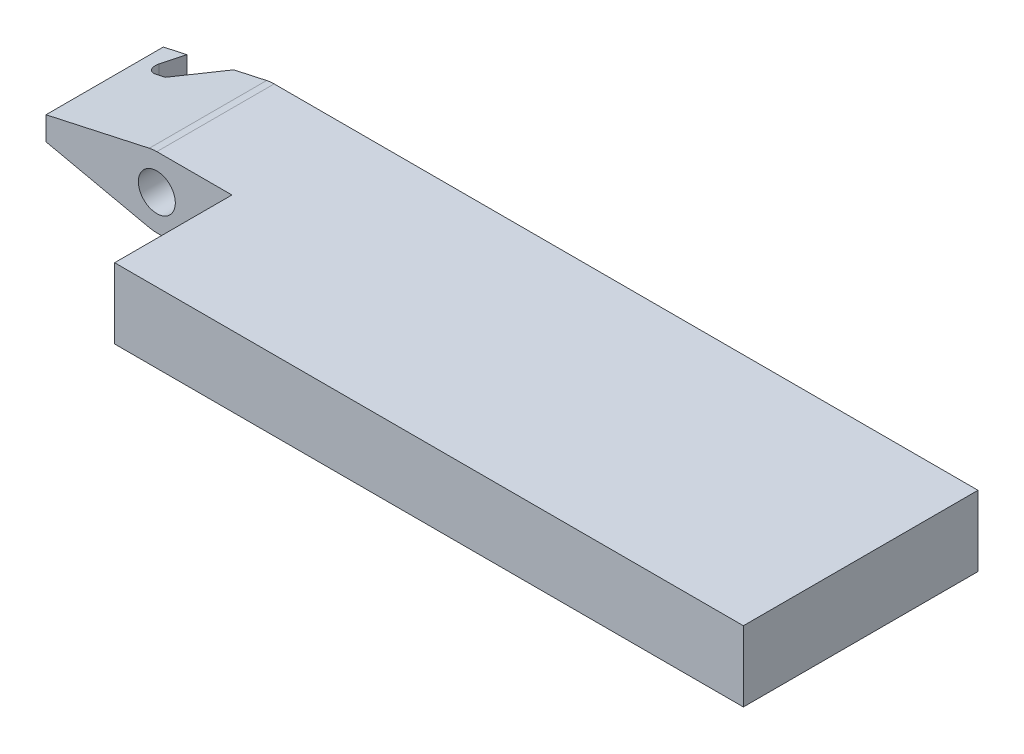
ISO-10303-21;
HEADER;
FILE_DESCRIPTION(('STEP AP214'),'2;1');
FILE_NAME('part.step','',(''),(''),'','','');
FILE_SCHEMA(('AUTOMOTIVE_DESIGN { 1 0 10303 214 1 1 1 1 }'));
ENDSEC;
DATA;
#1=APPLICATION_CONTEXT('core data for automotive mechanical design processes');
#2=APPLICATION_PROTOCOL_DEFINITION('international standard','automotive_design',2000,#1);
#3=PRODUCT_CONTEXT('',#1,'mechanical');
#4=PRODUCT('Part','Part','',(#3));
#5=PRODUCT_RELATED_PRODUCT_CATEGORY('part','',(#4));
#6=PRODUCT_DEFINITION_FORMATION('','',#4);
#7=PRODUCT_DEFINITION_CONTEXT('part definition',#1,'design');
#8=PRODUCT_DEFINITION('design','',#6,#7);
#9=PRODUCT_DEFINITION_SHAPE('','',#8);
#10=(LENGTH_UNIT() NAMED_UNIT(*) SI_UNIT(.MILLI.,.METRE.));
#11=(NAMED_UNIT(*) PLANE_ANGLE_UNIT() SI_UNIT($,.RADIAN.));
#12=(NAMED_UNIT(*) SI_UNIT($,.STERADIAN.) SOLID_ANGLE_UNIT());
#13=UNCERTAINTY_MEASURE_WITH_UNIT(LENGTH_MEASURE(1.E-05),#10,'distance_accuracy_value','');
#14=(GEOMETRIC_REPRESENTATION_CONTEXT(3) GLOBAL_UNCERTAINTY_ASSIGNED_CONTEXT((#13)) GLOBAL_UNIT_ASSIGNED_CONTEXT((#10,
#11,#12)) REPRESENTATION_CONTEXT('',''));
#15=CARTESIAN_POINT('',(0.,0.,0.));
#16=DIRECTION('',(0.,0.,1.));
#17=DIRECTION('',(1.,0.,0.));
#18=AXIS2_PLACEMENT_3D('',#15,#16,#17);
#19=CARTESIAN_POINT('',(0.,3.81,-12.7));
#20=DIRECTION('',(0.,0.,1.));
#21=DIRECTION('',(1.,0.,0.));
#22=AXIS2_PLACEMENT_3D('',#19,#20,#21);
#23=PLANE('',#22);
#24=DIRECTION('',(0.976807089673857,0.214121249676183,0.));
#25=VECTOR('',#24,1.);
#26=CARTESIAN_POINT('',(-0.407900980633129,3.7658175058287,-12.7));
#27=LINE('',#26,#25);
#28=CARTESIAN_POINT('',(-6.,2.54,-12.7));
#29=VERTEX_POINT('',#28);
#30=CARTESIAN_POINT('',(-4.73,2.81839067709833,-12.7));
#31=VERTEX_POINT('',#30);
#32=EDGE_CURVE('E177',#29,#31,#27,.T.);
#33=ORIENTED_EDGE('',*,*,#32,.T.);
#34=DIRECTION('',(0.,-1.,0.));
#35=VECTOR('',#34,1.);
#36=CARTESIAN_POINT('',(-4.73,3.81,-12.7));
#37=LINE('',#36,#35);
#38=CARTESIAN_POINT('',(-4.73,0.991609322901672,-12.7));
#39=VERTEX_POINT('',#38);
#40=EDGE_CURVE('E306',#31,#39,#37,.T.);
#41=ORIENTED_EDGE('',*,*,#40,.T.);
#42=DIRECTION('',(-0.976807089673857,0.214121249676183,0.));
#43=VECTOR('',#42,1.);
#44=CARTESIAN_POINT('',(-6.,1.27,-12.7));
#45=LINE('',#44,#43);
#46=CARTESIAN_POINT('',(-6.,1.27,-12.7));
#47=VERTEX_POINT('',#46);
#48=EDGE_CURVE('E297',#39,#47,#45,.T.);
#49=ORIENTED_EDGE('',*,*,#48,.T.);
#50=DIRECTION('',(0.,1.,0.));
#51=VECTOR('',#50,1.);
#52=CARTESIAN_POINT('',(-6.,2.54,-12.7));
#53=LINE('',#52,#51);
#54=EDGE_CURVE('E178',#47,#29,#53,.T.);
#55=ORIENTED_EDGE('',*,*,#54,.T.);
#56=EDGE_LOOP('',(#33,#41,#49,#55));
#57=FACE_BOUND('',#56,.T.);
#58=ADVANCED_FACE('F39',(#57),#23,.F.);
#59=CARTESIAN_POINT('',(0.,3.81,0.));
#60=DIRECTION('',(0.,0.,-1.));
#61=DIRECTION('',(-1.,0.,0.));
#62=AXIS2_PLACEMENT_3D('',#59,#60,#61);
#63=PLANE('',#62);
#64=DIRECTION('',(1.,0.,0.));
#65=VECTOR('',#64,1.);
#66=CARTESIAN_POINT('',(0.,3.81,0.));
#67=LINE('',#66,#65);
#68=CARTESIAN_POINT('',(4.064,3.81,0.));
#69=VERTEX_POINT('',#68);
#70=CARTESIAN_POINT('',(38.1,3.81,0.));
#71=VERTEX_POINT('',#70);
#72=EDGE_CURVE('E232',#69,#71,#67,.T.);
#73=ORIENTED_EDGE('',*,*,#72,.F.);
#74=DIRECTION('',(0.,1.,0.));
#75=VECTOR('',#74,1.);
#76=CARTESIAN_POINT('',(4.064,0.,0.));
#77=LINE('',#76,#75);
#78=CARTESIAN_POINT('',(4.064,0.,0.));
#79=VERTEX_POINT('',#78);
#80=EDGE_CURVE('E215',#79,#69,#77,.T.);
#81=ORIENTED_EDGE('',*,*,#80,.F.);
#82=DIRECTION('',(1.,0.,0.));
#83=VECTOR('',#82,1.);
#84=CARTESIAN_POINT('',(0.,0.,0.));
#85=LINE('',#84,#83);
#86=CARTESIAN_POINT('',(38.1,0.,0.));
#87=VERTEX_POINT('',#86);
#88=EDGE_CURVE('E247',#79,#87,#85,.T.);
#89=ORIENTED_EDGE('',*,*,#88,.T.);
#90=DIRECTION('',(0.,-1.,0.));
#91=VECTOR('',#90,1.);
#92=CARTESIAN_POINT('',(38.1,3.81,0.));
#93=LINE('',#92,#91);
#94=EDGE_CURVE('E258',#71,#87,#93,.T.);
#95=ORIENTED_EDGE('',*,*,#94,.F.);
#96=EDGE_LOOP('',(#73,#81,#89,#95));
#97=FACE_BOUND('',#96,.T.);
#98=ADVANCED_FACE('F325',(#97),#63,.F.);
#99=CARTESIAN_POINT('',(38.1,3.81,0.));
#100=DIRECTION('',(-1.,0.,0.));
#101=DIRECTION('',(0.,0.,1.));
#102=AXIS2_PLACEMENT_3D('',#99,#100,#101);
#103=PLANE('',#102);
#104=DIRECTION('',(0.,0.,-1.));
#105=VECTOR('',#104,1.);
#106=CARTESIAN_POINT('',(38.1,0.,0.));
#107=LINE('',#106,#105);
#108=CARTESIAN_POINT('',(38.1,0.,-12.7));
#109=VERTEX_POINT('',#108);
#110=EDGE_CURVE('E250',#87,#109,#107,.T.);
#111=ORIENTED_EDGE('',*,*,#110,.T.);
#112=DIRECTION('',(0.,-1.,0.));
#113=VECTOR('',#112,1.);
#114=CARTESIAN_POINT('',(38.1,3.81,-12.7));
#115=LINE('',#114,#113);
#116=CARTESIAN_POINT('',(38.1,3.81,-12.7));
#117=VERTEX_POINT('',#116);
#118=EDGE_CURVE('E243',#117,#109,#115,.T.);
#119=ORIENTED_EDGE('',*,*,#118,.F.);
#120=DIRECTION('',(0.,0.,-1.));
#121=VECTOR('',#120,1.);
#122=CARTESIAN_POINT('',(38.1,3.81,0.));
#123=LINE('',#122,#121);
#124=EDGE_CURVE('E236',#71,#117,#123,.T.);
#125=ORIENTED_EDGE('',*,*,#124,.F.);
#126=ORIENTED_EDGE('',*,*,#94,.T.);
#127=EDGE_LOOP('',(#111,#119,#125,#126));
#128=FACE_BOUND('',#127,.T.);
#129=ADVANCED_FACE('F330',(#128),#103,.F.);
#130=CARTESIAN_POINT('',(-0.407900980633129,0.0441824941713048,-12.7));
#131=VERTEX_POINT('',#130);
#132=CARTESIAN_POINT('',(-2.19,0.434827968705013,-12.7));
#133=VERTEX_POINT('',#132);
#134=EDGE_CURVE('E167',#131,#133,#45,.T.);
#135=ORIENTED_EDGE('',*,*,#134,.T.);
#136=DIRECTION('',(0.,-1.,0.));
#137=VECTOR('',#136,1.);
#138=CARTESIAN_POINT('',(-2.19,3.81,-12.7));
#139=LINE('',#138,#137);
#140=CARTESIAN_POINT('',(-2.19,3.37517203129499,-12.7));
#141=VERTEX_POINT('',#140);
#142=EDGE_CURVE('E149',#141,#133,#139,.T.);
#143=ORIENTED_EDGE('',*,*,#142,.F.);
#144=CARTESIAN_POINT('',(-0.407900980633129,3.7658175058287,-12.7));
#145=VERTEX_POINT('',#144);
#146=EDGE_CURVE('E164',#141,#145,#27,.T.);
#147=ORIENTED_EDGE('',*,*,#146,.T.);
#148=CARTESIAN_POINT('',(0.,1.905,-12.7));
#149=DIRECTION('',(0.,0.,-1.));
#150=DIRECTION('',(-1.,0.,0.));
#151=AXIS2_PLACEMENT_3D('',#148,#149,#150);
#152=CIRCLE('',#151,1.905);
#153=CARTESIAN_POINT('',(0.,3.81,-12.7));
#154=VERTEX_POINT('',#153);
#155=EDGE_CURVE('E295',#145,#154,#152,.T.);
#156=ORIENTED_EDGE('',*,*,#155,.T.);
#157=DIRECTION('',(-1.,0.,0.));
#158=VECTOR('',#157,1.);
#159=CARTESIAN_POINT('',(0.,3.81,-12.7));
#160=LINE('',#159,#158);
#161=EDGE_CURVE('E239',#117,#154,#160,.T.);
#162=ORIENTED_EDGE('',*,*,#161,.F.);
#163=ORIENTED_EDGE('',*,*,#118,.T.);
#164=DIRECTION('',(-1.,0.,0.));
#165=VECTOR('',#164,1.);
#166=CARTESIAN_POINT('',(0.,0.,-12.7));
#167=LINE('',#166,#165);
#168=CARTESIAN_POINT('',(0.,0.,-12.7));
#169=VERTEX_POINT('',#168);
#170=EDGE_CURVE('E233',#109,#169,#167,.T.);
#171=ORIENTED_EDGE('',*,*,#170,.T.);
#172=EDGE_CURVE('E298',#169,#131,#152,.T.);
#173=ORIENTED_EDGE('',*,*,#172,.T.);
#174=EDGE_LOOP('',(#135,#143,#147,#156,#162,#163,#171,#173));
#175=FACE_BOUND('',#174,.T.);
#176=CARTESIAN_POINT('',(0.,1.905,-12.7));
#177=DIRECTION('',(0.,0.,-1.));
#178=DIRECTION('',(-1.,0.,0.));
#179=AXIS2_PLACEMENT_3D('',#176,#177,#178);
#180=CIRCLE('',#179,1.);
#181=CARTESIAN_POINT('',(-1.,1.905,-12.7));
#182=VERTEX_POINT('',#181);
#183=EDGE_CURVE('E201',#182,#182,#180,.T.);
#184=ORIENTED_EDGE('',*,*,#183,.F.);
#185=EDGE_LOOP('',(#184));
#186=FACE_BOUND('',#185,.T.);
#187=ADVANCED_FACE('F161',(#175,#186),#23,.F.);
#188=CARTESIAN_POINT('',(0.,3.81,0.));
#189=DIRECTION('',(0.,-1.,0.));
#190=DIRECTION('',(0.,0.,-1.));
#191=AXIS2_PLACEMENT_3D('',#188,#189,#190);
#192=PLANE('',#191);
#193=DIRECTION('',(0.,0.,1.));
#194=VECTOR('',#193,1.);
#195=CARTESIAN_POINT('',(0.,3.81,0.));
#196=LINE('',#195,#194);
#197=CARTESIAN_POINT('',(0.,3.81,-6.35));
#198=VERTEX_POINT('',#197);
#199=EDGE_CURVE('E228',#154,#198,#196,.T.);
#200=ORIENTED_EDGE('',*,*,#199,.T.);
#201=DIRECTION('',(-1.,0.,0.));
#202=VECTOR('',#201,1.);
#203=CARTESIAN_POINT('',(0.,3.81,-6.35));
#204=LINE('',#203,#202);
#205=CARTESIAN_POINT('',(4.064,3.81,-6.35));
#206=VERTEX_POINT('',#205);
#207=EDGE_CURVE('E212',#206,#198,#204,.T.);
#208=ORIENTED_EDGE('',*,*,#207,.F.);
#209=DIRECTION('',(0.,0.,-1.));
#210=VECTOR('',#209,1.);
#211=CARTESIAN_POINT('',(4.064,3.81,0.));
#212=LINE('',#211,#210);
#213=EDGE_CURVE('E205',#69,#206,#212,.T.);
#214=ORIENTED_EDGE('',*,*,#213,.F.);
#215=ORIENTED_EDGE('',*,*,#72,.T.);
#216=ORIENTED_EDGE('',*,*,#124,.T.);
#217=ORIENTED_EDGE('',*,*,#161,.T.);
#218=EDGE_LOOP('',(#200,#208,#214,#215,#216,#217));
#219=FACE_BOUND('',#218,.T.);
#220=ADVANCED_FACE('F335',(#219),#192,.F.);
#221=CARTESIAN_POINT('',(0.,0.,0.));
#222=DIRECTION('',(0.,-1.,0.));
#223=DIRECTION('',(0.,0.,-1.));
#224=AXIS2_PLACEMENT_3D('',#221,#222,#223);
#225=PLANE('',#224);
#226=DIRECTION('',(-1.,0.,0.));
#227=VECTOR('',#226,1.);
#228=CARTESIAN_POINT('',(0.,0.,-6.35));
#229=LINE('',#228,#227);
#230=CARTESIAN_POINT('',(4.064,0.,-6.35));
#231=VERTEX_POINT('',#230);
#232=CARTESIAN_POINT('',(0.,0.,-6.35));
#233=VERTEX_POINT('',#232);
#234=EDGE_CURVE('E211',#231,#233,#229,.T.);
#235=ORIENTED_EDGE('',*,*,#234,.T.);
#236=DIRECTION('',(0.,0.,1.));
#237=VECTOR('',#236,1.);
#238=CARTESIAN_POINT('',(0.,0.,0.));
#239=LINE('',#238,#237);
#240=EDGE_CURVE('E225',#169,#233,#239,.T.);
#241=ORIENTED_EDGE('',*,*,#240,.F.);
#242=ORIENTED_EDGE('',*,*,#170,.F.);
#243=ORIENTED_EDGE('',*,*,#110,.F.);
#244=ORIENTED_EDGE('',*,*,#88,.F.);
#245=DIRECTION('',(0.,0.,-1.));
#246=VECTOR('',#245,1.);
#247=CARTESIAN_POINT('',(4.064,0.,0.));
#248=LINE('',#247,#246);
#249=EDGE_CURVE('E207',#79,#231,#248,.T.);
#250=ORIENTED_EDGE('',*,*,#249,.T.);
#251=EDGE_LOOP('',(#235,#241,#242,#243,#244,#250));
#252=FACE_BOUND('',#251,.T.);
#253=ADVANCED_FACE('F340',(#252),#225,.T.);
#254=CARTESIAN_POINT('',(0.,0.,-6.35));
#255=DIRECTION('',(0.,0.,-1.));
#256=DIRECTION('',(-1.,0.,0.));
#257=AXIS2_PLACEMENT_3D('',#254,#255,#256);
#258=PLANE('',#257);
#259=CARTESIAN_POINT('',(0.,1.905,-6.35));
#260=DIRECTION('',(0.,0.,-1.));
#261=DIRECTION('',(-1.,0.,0.));
#262=AXIS2_PLACEMENT_3D('',#259,#260,#261);
#263=CIRCLE('',#262,1.);
#264=CARTESIAN_POINT('',(-1.,1.905,-6.35));
#265=VERTEX_POINT('',#264);
#266=EDGE_CURVE('E157',#265,#265,#263,.T.);
#267=ORIENTED_EDGE('',*,*,#266,.T.);
#268=EDGE_LOOP('',(#267));
#269=FACE_BOUND('',#268,.T.);
#270=ORIENTED_EDGE('',*,*,#207,.T.);
#271=CARTESIAN_POINT('',(0.,1.905,-6.35));
#272=DIRECTION('',(0.,0.,-1.));
#273=DIRECTION('',(-1.,0.,0.));
#274=AXIS2_PLACEMENT_3D('',#271,#272,#273);
#275=CIRCLE('',#274,1.905);
#276=CARTESIAN_POINT('',(-0.407900980633129,3.7658175058287,-6.35));
#277=VERTEX_POINT('',#276);
#278=EDGE_CURVE('E283',#198,#277,#275,.F.);
#279=ORIENTED_EDGE('',*,*,#278,.T.);
#280=DIRECTION('',(-0.976807089673857,-0.214121249676183,0.));
#281=VECTOR('',#280,1.);
#282=CARTESIAN_POINT('',(-0.407900980633129,3.7658175058287,-6.35));
#283=LINE('',#282,#281);
#284=CARTESIAN_POINT('',(-6.,2.54,-6.35));
#285=VERTEX_POINT('',#284);
#286=EDGE_CURVE('E286',#277,#285,#283,.T.);
#287=ORIENTED_EDGE('',*,*,#286,.T.);
#288=DIRECTION('',(0.,-1.,0.));
#289=VECTOR('',#288,1.);
#290=CARTESIAN_POINT('',(-6.,2.54,-6.35));
#291=LINE('',#290,#289);
#292=CARTESIAN_POINT('',(-6.,1.27,-6.35));
#293=VERTEX_POINT('',#292);
#294=EDGE_CURVE('E190',#285,#293,#291,.T.);
#295=ORIENTED_EDGE('',*,*,#294,.T.);
#296=DIRECTION('',(0.976807089673857,-0.214121249676183,0.));
#297=VECTOR('',#296,1.);
#298=CARTESIAN_POINT('',(-6.,1.27,-6.35));
#299=LINE('',#298,#297);
#300=CARTESIAN_POINT('',(-0.407900980633129,0.0441824941713048,-6.35));
#301=VERTEX_POINT('',#300);
#302=EDGE_CURVE('E206',#293,#301,#299,.T.);
#303=ORIENTED_EDGE('',*,*,#302,.T.);
#304=EDGE_CURVE('E279',#301,#233,#275,.F.);
#305=ORIENTED_EDGE('',*,*,#304,.T.);
#306=ORIENTED_EDGE('',*,*,#234,.F.);
#307=DIRECTION('',(0.,1.,0.));
#308=VECTOR('',#307,1.);
#309=CARTESIAN_POINT('',(4.064,0.,-6.35));
#310=LINE('',#309,#308);
#311=EDGE_CURVE('E222',#231,#206,#310,.T.);
#312=ORIENTED_EDGE('',*,*,#311,.T.);
#313=EDGE_LOOP('',(#270,#279,#287,#295,#303,#305,#306,#312));
#314=FACE_BOUND('',#313,.T.);
#315=ADVANCED_FACE('F394',(#269,#314),#258,.F.);
#316=CARTESIAN_POINT('',(4.064,0.,0.));
#317=DIRECTION('',(1.,0.,0.));
#318=DIRECTION('',(0.,0.,-1.));
#319=AXIS2_PLACEMENT_3D('',#316,#317,#318);
#320=PLANE('',#319);
#321=ORIENTED_EDGE('',*,*,#213,.T.);
#322=ORIENTED_EDGE('',*,*,#311,.F.);
#323=ORIENTED_EDGE('',*,*,#249,.F.);
#324=ORIENTED_EDGE('',*,*,#80,.T.);
#325=EDGE_LOOP('',(#321,#322,#323,#324));
#326=FACE_BOUND('',#325,.T.);
#327=ADVANCED_FACE('F392',(#326),#320,.F.);
#328=CARTESIAN_POINT('',(0.,1.905,0.));
#329=DIRECTION('',(0.,0.,-1.));
#330=DIRECTION('',(-1.,0.,0.));
#331=AXIS2_PLACEMENT_3D('',#328,#329,#330);
#332=CYLINDRICAL_SURFACE('',#331,1.);
#333=ORIENTED_EDGE('',*,*,#183,.T.);
#334=EDGE_LOOP('',(#333));
#335=FACE_BOUND('',#334,.T.);
#336=ORIENTED_EDGE('',*,*,#266,.F.);
#337=EDGE_LOOP('',(#336));
#338=FACE_BOUND('',#337,.T.);
#339=ADVANCED_FACE('F389',(#335,#338),#332,.F.);
#340=CARTESIAN_POINT('',(0.,1.905,2.42525640651029));
#341=DIRECTION('',(0.,0.,-1.));
#342=DIRECTION('',(-1.,0.,0.));
#343=AXIS2_PLACEMENT_3D('',#340,#341,#342);
#344=CYLINDRICAL_SURFACE('',#343,1.905);
#345=ORIENTED_EDGE('',*,*,#240,.T.);
#346=ORIENTED_EDGE('',*,*,#304,.F.);
#347=DIRECTION('',(0.,0.,-1.));
#348=VECTOR('',#347,1.);
#349=CARTESIAN_POINT('',(-0.407900980633129,0.0441824941713048,2.42525640651029));
#350=LINE('',#349,#348);
#351=EDGE_CURVE('E183',#301,#131,#350,.T.);
#352=ORIENTED_EDGE('',*,*,#351,.T.);
#353=ORIENTED_EDGE('',*,*,#172,.F.);
#354=EDGE_LOOP('',(#345,#346,#352,#353));
#355=FACE_BOUND('',#354,.T.);
#356=ADVANCED_FACE('F358',(#355),#344,.T.);
#357=CARTESIAN_POINT('',(-6.,1.27,2.42525640651029));
#358=DIRECTION('',(-0.214121249676183,-0.976807089673857,0.));
#359=DIRECTION('',(0.976807089673857,-0.214121249676183,0.));
#360=AXIS2_PLACEMENT_3D('',#357,#358,#359);
#361=PLANE('',#360);
#362=DIRECTION('',(0.341062947383633,-0.0747627912246309,-0.937062746549179));
#363=VECTOR('',#362,1.);
#364=CARTESIAN_POINT('',(-9.71882238241687,2.08518541814917,1.00667684536027));
#365=LINE('',#364,#363);
#366=CARTESIAN_POINT('',(-5.12900374045955,1.07907304059561,-11.6037462328094));
#367=VERTEX_POINT('',#366);
#368=EDGE_CURVE('E360',#367,#39,#365,.T.);
#369=ORIENTED_EDGE('',*,*,#368,.F.);
#370=CARTESIAN_POINT('',(-4.65163988910031,0.974432374609652,-11.43));
#371=DIRECTION('',(-0.214121249676183,-0.976807089673857,0.));
#372=DIRECTION('',(-0.976807089673857,0.214121249676183,0.));
#373=AXIS2_PLACEMENT_3D('',#370,#371,#372);
#374=ELLIPSE('',#373,0.520061745425716,0.508);
#375=CARTESIAN_POINT('',(-4.65163988910031,0.974432374609652,-10.922));
#376=VERTEX_POINT('',#375);
#377=EDGE_CURVE('E48',#367,#376,#374,.F.);
#378=ORIENTED_EDGE('',*,*,#377,.T.);
#379=DIRECTION('',(-0.976807089673857,0.214121249676183,0.));
#380=VECTOR('',#379,1.);
#381=CARTESIAN_POINT('',(-6.,1.27,-10.922));
#382=LINE('',#381,#380);
#383=CARTESIAN_POINT('',(-4.1071390765253,0.855074933748749,-10.922));
#384=VERTEX_POINT('',#383);
#385=EDGE_CURVE('E362',#384,#376,#382,.T.);
#386=ORIENTED_EDGE('',*,*,#385,.F.);
#387=DIRECTION('',(-0.723922350531886,0.158687585300146,0.671382663368662));
#388=VECTOR('',#387,1.);
#389=CARTESIAN_POINT('',(-11.6339366386724,2.50498853194417,-3.94147040287094));
#390=LINE('',#389,#388);
#391=EDGE_CURVE('E364',#133,#384,#390,.T.);
#392=ORIENTED_EDGE('',*,*,#391,.F.);
#393=ORIENTED_EDGE('',*,*,#134,.F.);
#394=ORIENTED_EDGE('',*,*,#351,.F.);
#395=ORIENTED_EDGE('',*,*,#302,.F.);
#396=DIRECTION('',(0.,0.,-1.));
#397=VECTOR('',#396,1.);
#398=CARTESIAN_POINT('',(-6.,1.27,2.42525640651029));
#399=LINE('',#398,#397);
#400=EDGE_CURVE('E194',#293,#47,#399,.T.);
#401=ORIENTED_EDGE('',*,*,#400,.T.);
#402=ORIENTED_EDGE('',*,*,#48,.F.);
#403=EDGE_LOOP('',(#369,#378,#386,#392,#393,#394,#395,#401,#402));
#404=FACE_BOUND('',#403,.T.);
#405=ADVANCED_FACE('F308',(#404),#361,.T.);
#406=CARTESIAN_POINT('',(-6.,2.54,2.42525640651029));
#407=DIRECTION('',(-1.,0.,0.));
#408=DIRECTION('',(0.,0.,1.));
#409=AXIS2_PLACEMENT_3D('',#406,#407,#408);
#410=PLANE('',#409);
#411=ORIENTED_EDGE('',*,*,#294,.F.);
#412=DIRECTION('',(0.,0.,-1.));
#413=VECTOR('',#412,1.);
#414=CARTESIAN_POINT('',(-6.,2.54,2.42525640651029));
#415=LINE('',#414,#413);
#416=EDGE_CURVE('E191',#285,#29,#415,.T.);
#417=ORIENTED_EDGE('',*,*,#416,.T.);
#418=ORIENTED_EDGE('',*,*,#54,.F.);
#419=ORIENTED_EDGE('',*,*,#400,.F.);
#420=EDGE_LOOP('',(#411,#417,#418,#419));
#421=FACE_BOUND('',#420,.T.);
#422=ADVANCED_FACE('F311',(#421),#410,.T.);
#423=CARTESIAN_POINT('',(-0.407900980633129,3.7658175058287,2.42525640651029));
#424=DIRECTION('',(-0.214121249676183,0.976807089673857,0.));
#425=DIRECTION('',(-0.976807089673857,-0.214121249676183,0.));
#426=AXIS2_PLACEMENT_3D('',#423,#424,#425);
#427=PLANE('',#426);
#428=DIRECTION('',(-0.341062947383633,-0.0747627912246309,0.937062746549179));
#429=VECTOR('',#428,1.);
#430=CARTESIAN_POINT('',(-9.03707052733416,1.8742581728347,-0.86642098215078));
#431=LINE('',#430,#429);
#432=CARTESIAN_POINT('',(-5.12900374045955,2.73092695940439,-11.6037462328094));
#433=VERTEX_POINT('',#432);
#434=EDGE_CURVE('E267',#31,#433,#431,.T.);
#435=ORIENTED_EDGE('',*,*,#434,.F.);
#436=ORIENTED_EDGE('',*,*,#32,.F.);
#437=ORIENTED_EDGE('',*,*,#416,.F.);
#438=ORIENTED_EDGE('',*,*,#286,.F.);
#439=DIRECTION('',(0.,0.,-1.));
#440=VECTOR('',#439,1.);
#441=CARTESIAN_POINT('',(-0.407900980633129,3.7658175058287,2.42525640651029));
#442=LINE('',#441,#440);
#443=EDGE_CURVE('E174',#277,#145,#442,.T.);
#444=ORIENTED_EDGE('',*,*,#443,.T.);
#445=ORIENTED_EDGE('',*,*,#146,.F.);
#446=DIRECTION('',(0.723922350531886,0.158687585300146,-0.671382663368662));
#447=VECTOR('',#446,1.);
#448=CARTESIAN_POINT('',(-8.56250242706644,1.97828599548257,-6.78999093802854));
#449=LINE('',#448,#447);
#450=CARTESIAN_POINT('',(-4.1071390765253,2.95492506625125,-10.922));
#451=VERTEX_POINT('',#450);
#452=EDGE_CURVE('E146',#451,#141,#449,.T.);
#453=ORIENTED_EDGE('',*,*,#452,.F.);
#454=DIRECTION('',(0.976807089673857,0.214121249676183,0.));
#455=VECTOR('',#454,1.);
#456=CARTESIAN_POINT('',(-0.407900980633129,3.7658175058287,-10.922));
#457=LINE('',#456,#455);
#458=CARTESIAN_POINT('',(-4.65163988910031,2.83556762539035,-10.922));
#459=VERTEX_POINT('',#458);
#460=EDGE_CURVE('E156',#459,#451,#457,.T.);
#461=ORIENTED_EDGE('',*,*,#460,.F.);
#462=CARTESIAN_POINT('',(-4.65163988910031,2.83556762539035,-11.43));
#463=DIRECTION('',(-0.214121249676183,0.976807089673857,0.));
#464=DIRECTION('',(0.976807089673857,0.214121249676183,0.));
#465=AXIS2_PLACEMENT_3D('',#462,#463,#464);
#466=ELLIPSE('',#465,0.520061745425716,0.508);
#467=EDGE_CURVE('E11',#459,#433,#466,.F.);
#468=ORIENTED_EDGE('',*,*,#467,.T.);
#469=EDGE_LOOP('',(#435,#436,#437,#438,#444,#445,#453,#461,#468));
#470=FACE_BOUND('',#469,.T.);
#471=ADVANCED_FACE('F171',(#470),#427,.T.);
#472=ORIENTED_EDGE('',*,*,#278,.F.);
#473=ORIENTED_EDGE('',*,*,#199,.F.);
#474=ORIENTED_EDGE('',*,*,#155,.F.);
#475=ORIENTED_EDGE('',*,*,#443,.F.);
#476=EDGE_LOOP('',(#472,#473,#474,#475));
#477=FACE_BOUND('',#476,.T.);
#478=ADVANCED_FACE('F377',(#477),#344,.T.);
#479=CARTESIAN_POINT('',(-4.73,3.81,-12.7));
#480=DIRECTION('',(-0.939692620785909,0.,-0.342020143325666));
#481=DIRECTION('',(-0.342020143325666,0.,0.939692620785909));
#482=AXIS2_PLACEMENT_3D('',#479,#480,#481);
#483=PLANE('',#482);
#484=ORIENTED_EDGE('',*,*,#434,.T.);
#485=DIRECTION('',(0.,-1.,0.));
#486=VECTOR('',#485,1.);
#487=CARTESIAN_POINT('',(-5.12900374045955,1.13346561084708,-11.6037462328094));
#488=LINE('',#487,#486);
#489=EDGE_CURVE('E271',#433,#367,#488,.T.);
#490=ORIENTED_EDGE('',*,*,#489,.T.);
#491=ORIENTED_EDGE('',*,*,#368,.T.);
#492=ORIENTED_EDGE('',*,*,#40,.F.);
#493=EDGE_LOOP('',(#484,#490,#491,#492));
#494=FACE_BOUND('',#493,.T.);
#495=ADVANCED_FACE('F316',(#494),#483,.F.);
#496=CARTESIAN_POINT('',(-5.3771390765253,3.81,-10.922));
#497=DIRECTION('',(0.,0.,1.));
#498=DIRECTION('',(1.,0.,0.));
#499=AXIS2_PLACEMENT_3D('',#496,#497,#498);
#500=PLANE('',#499);
#501=ORIENTED_EDGE('',*,*,#385,.T.);
#502=DIRECTION('',(0.,-1.,0.));
#503=VECTOR('',#502,1.);
#504=CARTESIAN_POINT('',(-4.65163988910031,2.67653438915292,-10.922));
#505=LINE('',#504,#503);
#506=EDGE_CURVE('E55',#376,#459,#505,.F.);
#507=ORIENTED_EDGE('',*,*,#506,.T.);
#508=ORIENTED_EDGE('',*,*,#460,.T.);
#509=DIRECTION('',(0.,-1.,0.));
#510=VECTOR('',#509,1.);
#511=CARTESIAN_POINT('',(-4.1071390765253,3.81,-10.922));
#512=LINE('',#511,#510);
#513=EDGE_CURVE('E152',#451,#384,#512,.T.);
#514=ORIENTED_EDGE('',*,*,#513,.T.);
#515=EDGE_LOOP('',(#501,#507,#508,#514));
#516=FACE_BOUND('',#515,.T.);
#517=ADVANCED_FACE('F322',(#516),#500,.F.);
#518=CARTESIAN_POINT('',(-4.1071390765253,3.81,-10.922));
#519=DIRECTION('',(0.679999035827433,0.,0.733213005390495));
#520=DIRECTION('',(0.733213005390495,0.,-0.679999035827433));
#521=AXIS2_PLACEMENT_3D('',#518,#519,#520);
#522=PLANE('',#521);
#523=ORIENTED_EDGE('',*,*,#391,.T.);
#524=ORIENTED_EDGE('',*,*,#513,.F.);
#525=ORIENTED_EDGE('',*,*,#452,.T.);
#526=ORIENTED_EDGE('',*,*,#142,.T.);
#527=EDGE_LOOP('',(#523,#524,#525,#526));
#528=FACE_BOUND('',#527,.T.);
#529=ADVANCED_FACE('F148',(#528),#522,.F.);
#530=CARTESIAN_POINT('',(-4.65163988910031,3.81,-11.43));
#531=DIRECTION('',(0.,1.,0.));
#532=DIRECTION('',(0.,0.,1.));
#533=AXIS2_PLACEMENT_3D('',#530,#531,#532);
#534=CYLINDRICAL_SURFACE('',#533,0.508);
#535=ORIENTED_EDGE('',*,*,#467,.F.);
#536=ORIENTED_EDGE('',*,*,#506,.F.);
#537=ORIENTED_EDGE('',*,*,#377,.F.);
#538=ORIENTED_EDGE('',*,*,#489,.F.);
#539=EDGE_LOOP('',(#535,#536,#537,#538));
#540=FACE_BOUND('',#539,.T.);
#541=ADVANCED_FACE('F41',(#540),#534,.F.);
#542=CLOSED_SHELL('',(#58,#98,#129,#187,#220,#253,#315,#327,#339,#356,#405,#422,#471,#478,#495,
#517,#529,#541));
#543=MANIFOLD_SOLID_BREP('B2',#542);
#544=ADVANCED_BREP_SHAPE_REPRESENTATION('',(#18,#543),#14);
#545=SHAPE_DEFINITION_REPRESENTATION(#9,#544);
ENDSEC;
END-ISO-10303-21;
